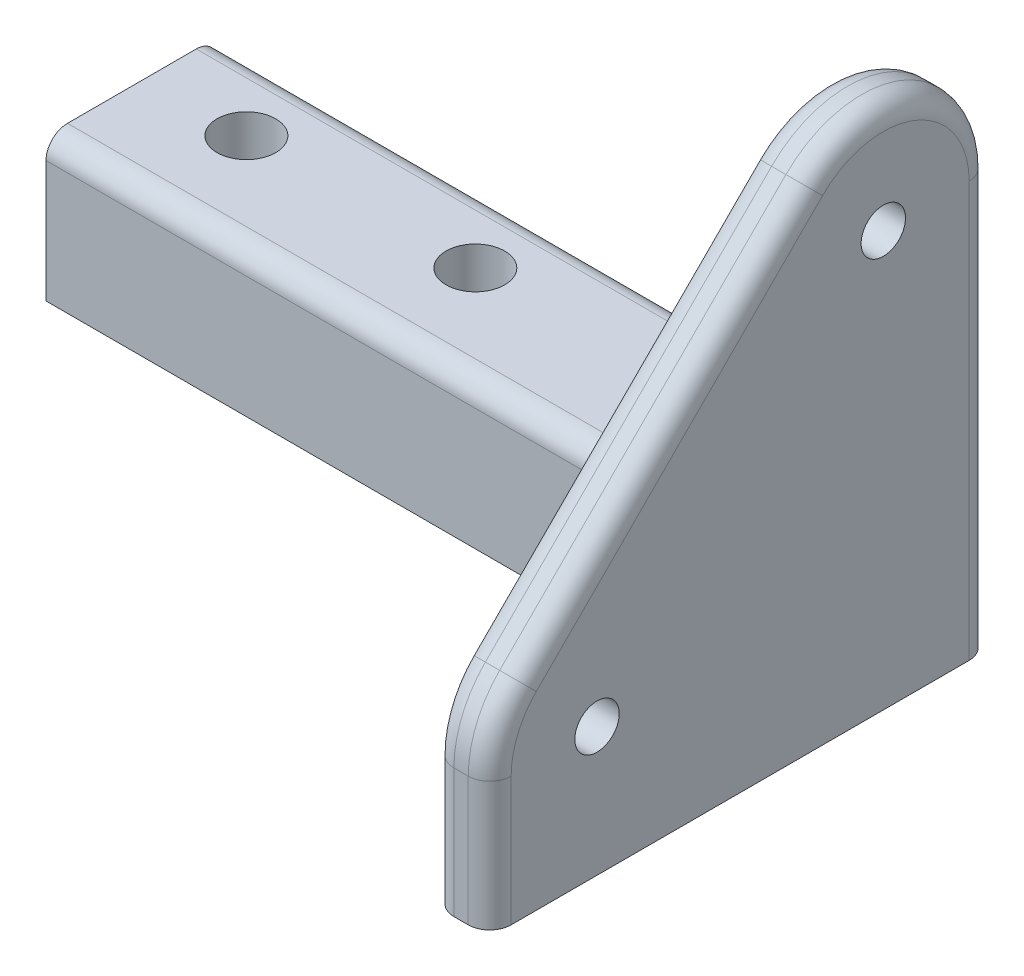
ISO-10303-21;
HEADER;
FILE_DESCRIPTION(('STEP AP214'),'2;1');
FILE_NAME('part.step','',(''),(''),'','','');
FILE_SCHEMA(('AUTOMOTIVE_DESIGN { 1 0 10303 214 1 1 1 1 }'));
ENDSEC;
DATA;
#1=APPLICATION_CONTEXT('core data for automotive mechanical design processes');
#2=APPLICATION_PROTOCOL_DEFINITION('international standard','automotive_design',2000,#1);
#3=PRODUCT_CONTEXT('',#1,'mechanical');
#4=PRODUCT('Part','Part','',(#3));
#5=PRODUCT_RELATED_PRODUCT_CATEGORY('part','',(#4));
#6=PRODUCT_DEFINITION_FORMATION('','',#4);
#7=PRODUCT_DEFINITION_CONTEXT('part definition',#1,'design');
#8=PRODUCT_DEFINITION('design','',#6,#7);
#9=PRODUCT_DEFINITION_SHAPE('','',#8);
#10=(LENGTH_UNIT() NAMED_UNIT(*) SI_UNIT(.MILLI.,.METRE.));
#11=(NAMED_UNIT(*) PLANE_ANGLE_UNIT() SI_UNIT($,.RADIAN.));
#12=(NAMED_UNIT(*) SI_UNIT($,.STERADIAN.) SOLID_ANGLE_UNIT());
#13=UNCERTAINTY_MEASURE_WITH_UNIT(LENGTH_MEASURE(1.E-05),#10,'distance_accuracy_value','');
#14=(GEOMETRIC_REPRESENTATION_CONTEXT(3) GLOBAL_UNCERTAINTY_ASSIGNED_CONTEXT((#13)) GLOBAL_UNIT_ASSIGNED_CONTEXT((#10,
#11,#12)) REPRESENTATION_CONTEXT('',''));
#15=CARTESIAN_POINT('',(0.,0.,0.));
#16=DIRECTION('',(0.,0.,1.));
#17=DIRECTION('',(1.,0.,0.));
#18=AXIS2_PLACEMENT_3D('',#15,#16,#17);
#19=CARTESIAN_POINT('',(115.,9.99999999999999,12.));
#20=DIRECTION('',(0.,-1.,0.));
#21=DIRECTION('',(1.,0.,0.));
#22=AXIS2_PLACEMENT_3D('',#19,#20,#21);
#23=PLANE('',#22);
#24=CARTESIAN_POINT('',(72.,10.,5.));
#25=DIRECTION('',(0.,-1.,0.));
#26=DIRECTION('',(0.,0.,-1.));
#27=AXIS2_PLACEMENT_3D('',#24,#25,#26);
#28=CIRCLE('',#27,2.04999999999999);
#29=CARTESIAN_POINT('',(72.,10.,2.95000000000001));
#30=VERTEX_POINT('',#29);
#31=EDGE_CURVE('E408',#30,#30,#28,.T.);
#32=ORIENTED_EDGE('',*,*,#31,.T.);
#33=EDGE_LOOP('',(#32));
#34=FACE_BOUND('',#33,.T.);
#35=DIRECTION('',(-1.,0.,0.));
#36=VECTOR('',#35,1.);
#37=CARTESIAN_POINT('',(115.,9.99999999999999,10.5));
#38=LINE('',#37,#36);
#39=CARTESIAN_POINT('',(65.,9.99999999999999,10.5));
#40=VERTEX_POINT('',#39);
#41=CARTESIAN_POINT('',(110.,9.99999999999999,10.5));
#42=VERTEX_POINT('',#41);
#43=EDGE_CURVE('E411',#40,#42,#38,.F.);
#44=ORIENTED_EDGE('',*,*,#43,.T.);
#45=DIRECTION('',(0.,0.,-1.));
#46=VECTOR('',#45,1.);
#47=CARTESIAN_POINT('',(110.,9.99999999999999,1.5));
#48=LINE('',#47,#46);
#49=CARTESIAN_POINT('',(110.,9.99999999999999,1.5));
#50=VERTEX_POINT('',#49);
#51=EDGE_CURVE('E89',#42,#50,#48,.T.);
#52=ORIENTED_EDGE('',*,*,#51,.T.);
#53=DIRECTION('',(-1.,0.,0.));
#54=VECTOR('',#53,1.);
#55=CARTESIAN_POINT('',(115.,9.99999999999999,1.5));
#56=LINE('',#55,#54);
#57=CARTESIAN_POINT('',(65.,9.99999999999999,1.5));
#58=VERTEX_POINT('',#57);
#59=EDGE_CURVE('E519',#50,#58,#56,.T.);
#60=ORIENTED_EDGE('',*,*,#59,.T.);
#61=DIRECTION('',(0.,0.,-1.));
#62=VECTOR('',#61,1.);
#63=CARTESIAN_POINT('',(65.,9.99999999999999,12.));
#64=LINE('',#63,#62);
#65=EDGE_CURVE('E231',#40,#58,#64,.T.);
#66=ORIENTED_EDGE('',*,*,#65,.F.);
#67=EDGE_LOOP('',(#44,#52,#60,#66));
#68=FACE_BOUND('',#67,.T.);
#69=CARTESIAN_POINT('',(88.,10.,5.));
#70=DIRECTION('',(0.,1.,0.));
#71=DIRECTION('',(0.,0.,1.));
#72=AXIS2_PLACEMENT_3D('',#69,#70,#71);
#73=CIRCLE('',#72,2.04999999999999);
#74=CARTESIAN_POINT('',(88.,10.,7.05));
#75=VERTEX_POINT('',#74);
#76=EDGE_CURVE('E321',#75,#75,#73,.T.);
#77=ORIENTED_EDGE('',*,*,#76,.F.);
#78=EDGE_LOOP('',(#77));
#79=FACE_BOUND('',#78,.T.);
#80=ADVANCED_FACE('F75',(#34,#68,#79),#23,.F.);
#81=CARTESIAN_POINT('',(65.,0.,12.));
#82=DIRECTION('',(0.,1.,0.));
#83=DIRECTION('',(0.,0.,1.));
#84=AXIS2_PLACEMENT_3D('',#81,#82,#83);
#85=PLANE('',#84);
#86=CARTESIAN_POINT('',(72.,0.,5.));
#87=DIRECTION('',(0.,-1.,0.));
#88=DIRECTION('',(0.,0.,-1.));
#89=AXIS2_PLACEMENT_3D('',#86,#87,#88);
#90=CIRCLE('',#89,2.04999999999999);
#91=CARTESIAN_POINT('',(72.,0.,2.95000000000001));
#92=VERTEX_POINT('',#91);
#93=EDGE_CURVE('E418',#92,#92,#90,.T.);
#94=ORIENTED_EDGE('',*,*,#93,.F.);
#95=EDGE_LOOP('',(#94));
#96=FACE_BOUND('',#95,.T.);
#97=DIRECTION('',(1.,0.,0.));
#98=VECTOR('',#97,1.);
#99=CARTESIAN_POINT('',(65.,0.,0.));
#100=LINE('',#99,#98);
#101=CARTESIAN_POINT('',(65.,0.,0.));
#102=VERTEX_POINT('',#101);
#103=CARTESIAN_POINT('',(117.5,0.,0.));
#104=VERTEX_POINT('',#103);
#105=EDGE_CURVE('E220',#102,#104,#100,.T.);
#106=ORIENTED_EDGE('',*,*,#105,.T.);
#107=CARTESIAN_POINT('',(117.5,0.,1.5));
#108=DIRECTION('',(0.,1.,0.));
#109=DIRECTION('',(0.,0.,1.));
#110=AXIS2_PLACEMENT_3D('',#107,#108,#109);
#111=CIRCLE('',#110,1.5);
#112=CARTESIAN_POINT('',(119.,0.,1.5));
#113=VERTEX_POINT('',#112);
#114=EDGE_CURVE('E511',#104,#113,#111,.F.);
#115=ORIENTED_EDGE('',*,*,#114,.T.);
#116=DIRECTION('',(0.,0.,-1.));
#117=VECTOR('',#116,1.);
#118=CARTESIAN_POINT('',(119.,0.,0.));
#119=LINE('',#118,#117);
#120=CARTESIAN_POINT('',(119.,0.,33.5));
#121=VERTEX_POINT('',#120);
#122=EDGE_CURVE('E431',#121,#113,#119,.T.);
#123=ORIENTED_EDGE('',*,*,#122,.F.);
#124=CARTESIAN_POINT('',(117.5,0.,33.5));
#125=DIRECTION('',(0.,1.,0.));
#126=DIRECTION('',(0.,0.,1.));
#127=AXIS2_PLACEMENT_3D('',#124,#125,#126);
#128=CIRCLE('',#127,1.5);
#129=CARTESIAN_POINT('',(117.5,0.,35.));
#130=VERTEX_POINT('',#129);
#131=EDGE_CURVE('E570',#121,#130,#128,.F.);
#132=ORIENTED_EDGE('',*,*,#131,.T.);
#133=DIRECTION('',(-1.,0.,0.));
#134=VECTOR('',#133,1.);
#135=CARTESIAN_POINT('',(119.,0.,35.));
#136=LINE('',#135,#134);
#137=CARTESIAN_POINT('',(116.5,0.,35.));
#138=VERTEX_POINT('',#137);
#139=EDGE_CURVE('E434',#130,#138,#136,.T.);
#140=ORIENTED_EDGE('',*,*,#139,.T.);
#141=CARTESIAN_POINT('',(116.5,0.,33.5));
#142=DIRECTION('',(0.,1.,0.));
#143=DIRECTION('',(0.,0.,1.));
#144=AXIS2_PLACEMENT_3D('',#141,#142,#143);
#145=CIRCLE('',#144,1.5);
#146=CARTESIAN_POINT('',(115.,0.,33.5));
#147=VERTEX_POINT('',#146);
#148=EDGE_CURVE('E572',#138,#147,#145,.F.);
#149=ORIENTED_EDGE('',*,*,#148,.T.);
#150=DIRECTION('',(0.,0.,-1.));
#151=VECTOR('',#150,1.);
#152=CARTESIAN_POINT('',(115.,0.,0.));
#153=LINE('',#152,#151);
#154=CARTESIAN_POINT('',(115.,0.,17.));
#155=VERTEX_POINT('',#154);
#156=EDGE_CURVE('E428',#147,#155,#153,.T.);
#157=ORIENTED_EDGE('',*,*,#156,.T.);
#158=DIRECTION('',(-0.70710678118655,0.,-0.707106781186545));
#159=VECTOR('',#158,1.);
#160=CARTESIAN_POINT('',(87.4999999999998,0.,-10.5));
#161=LINE('',#160,#159);
#162=CARTESIAN_POINT('',(110.,0.,12.));
#163=VERTEX_POINT('',#162);
#164=EDGE_CURVE('E12',#155,#163,#161,.T.);
#165=ORIENTED_EDGE('',*,*,#164,.T.);
#166=DIRECTION('',(1.,0.,0.));
#167=VECTOR('',#166,1.);
#168=CARTESIAN_POINT('',(65.,0.,12.));
#169=LINE('',#168,#167);
#170=CARTESIAN_POINT('',(65.,0.,12.));
#171=VERTEX_POINT('',#170);
#172=EDGE_CURVE('E215',#171,#163,#169,.T.);
#173=ORIENTED_EDGE('',*,*,#172,.F.);
#174=DIRECTION('',(0.,0.,-1.));
#175=VECTOR('',#174,1.);
#176=CARTESIAN_POINT('',(65.,0.,12.));
#177=LINE('',#176,#175);
#178=EDGE_CURVE('E223',#171,#102,#177,.T.);
#179=ORIENTED_EDGE('',*,*,#178,.T.);
#180=EDGE_LOOP('',(#106,#115,#123,#132,#140,#149,#157,#165,#173,#179));
#181=FACE_BOUND('',#180,.T.);
#182=CARTESIAN_POINT('',(88.,0.,5.));
#183=DIRECTION('',(0.,1.,0.));
#184=DIRECTION('',(0.,0.,1.));
#185=AXIS2_PLACEMENT_3D('',#182,#183,#184);
#186=CIRCLE('',#185,2.04999999999999);
#187=CARTESIAN_POINT('',(88.,0.,7.05));
#188=VERTEX_POINT('',#187);
#189=EDGE_CURVE('E415',#188,#188,#186,.T.);
#190=ORIENTED_EDGE('',*,*,#189,.T.);
#191=EDGE_LOOP('',(#190));
#192=FACE_BOUND('',#191,.T.);
#193=ADVANCED_FACE('F233',(#96,#181,#192),#85,.F.);
#194=CARTESIAN_POINT('',(65.,9.99999999999999,12.));
#195=DIRECTION('',(1.,0.,0.));
#196=DIRECTION('',(0.,0.,-1.));
#197=AXIS2_PLACEMENT_3D('',#194,#195,#196);
#198=PLANE('',#197);
#199=ORIENTED_EDGE('',*,*,#65,.T.);
#200=CARTESIAN_POINT('',(65.,8.49999999999999,1.5));
#201=DIRECTION('',(1.,0.,0.));
#202=DIRECTION('',(0.,0.,-1.));
#203=AXIS2_PLACEMENT_3D('',#200,#201,#202);
#204=CIRCLE('',#203,1.5);
#205=CARTESIAN_POINT('',(65.,8.49999999999999,0.));
#206=VERTEX_POINT('',#205);
#207=EDGE_CURVE('E532',#58,#206,#204,.F.);
#208=ORIENTED_EDGE('',*,*,#207,.T.);
#209=DIRECTION('',(0.,-1.,0.));
#210=VECTOR('',#209,1.);
#211=CARTESIAN_POINT('',(65.,9.99999999999999,0.));
#212=LINE('',#211,#210);
#213=EDGE_CURVE('E227',#206,#102,#212,.T.);
#214=ORIENTED_EDGE('',*,*,#213,.T.);
#215=ORIENTED_EDGE('',*,*,#178,.F.);
#216=DIRECTION('',(0.,-1.,0.));
#217=VECTOR('',#216,1.);
#218=CARTESIAN_POINT('',(65.,9.99999999999999,12.));
#219=LINE('',#218,#217);
#220=CARTESIAN_POINT('',(65.,8.49999999999999,12.));
#221=VERTEX_POINT('',#220);
#222=EDGE_CURVE('E210',#221,#171,#219,.T.);
#223=ORIENTED_EDGE('',*,*,#222,.F.);
#224=CARTESIAN_POINT('',(65.,8.49999999999999,10.5));
#225=DIRECTION('',(1.,0.,0.));
#226=DIRECTION('',(0.,0.,-1.));
#227=AXIS2_PLACEMENT_3D('',#224,#225,#226);
#228=CIRCLE('',#227,1.5);
#229=EDGE_CURVE('E522',#221,#40,#228,.F.);
#230=ORIENTED_EDGE('',*,*,#229,.T.);
#231=EDGE_LOOP('',(#199,#208,#214,#215,#223,#230));
#232=FACE_BOUND('',#231,.T.);
#233=ADVANCED_FACE('F225',(#232),#198,.F.);
#234=CARTESIAN_POINT('',(0.,0.,12.));
#235=DIRECTION('',(0.,0.,1.));
#236=DIRECTION('',(1.,0.,0.));
#237=AXIS2_PLACEMENT_3D('',#234,#235,#236);
#238=PLANE('',#237);
#239=ORIENTED_EDGE('',*,*,#172,.T.);
#240=DIRECTION('',(0.,1.,0.));
#241=VECTOR('',#240,1.);
#242=CARTESIAN_POINT('',(110.,0.,12.));
#243=LINE('',#242,#241);
#244=CARTESIAN_POINT('',(110.,8.49999999999999,12.));
#245=VERTEX_POINT('',#244);
#246=EDGE_CURVE('E262',#163,#245,#243,.T.);
#247=ORIENTED_EDGE('',*,*,#246,.T.);
#248=DIRECTION('',(-1.,0.,0.));
#249=VECTOR('',#248,1.);
#250=CARTESIAN_POINT('',(65.,8.49999999999999,12.));
#251=LINE('',#250,#249);
#252=EDGE_CURVE('E217',#245,#221,#251,.T.);
#253=ORIENTED_EDGE('',*,*,#252,.T.);
#254=ORIENTED_EDGE('',*,*,#222,.T.);
#255=EDGE_LOOP('',(#239,#247,#253,#254));
#256=FACE_BOUND('',#255,.T.);
#257=ADVANCED_FACE('F212',(#256),#238,.T.);
#258=CARTESIAN_POINT('',(0.,0.,0.));
#259=DIRECTION('',(0.,0.,1.));
#260=DIRECTION('',(1.,0.,0.));
#261=AXIS2_PLACEMENT_3D('',#258,#259,#260);
#262=PLANE('',#261);
#263=DIRECTION('',(-1.,0.,0.));
#264=VECTOR('',#263,1.);
#265=CARTESIAN_POINT('',(119.,29.,0.));
#266=LINE('',#265,#264);
#267=CARTESIAN_POINT('',(117.5,29.,0.));
#268=VERTEX_POINT('',#267);
#269=CARTESIAN_POINT('',(116.5,29.,0.));
#270=VERTEX_POINT('',#269);
#271=EDGE_CURVE('E241',#268,#270,#266,.T.);
#272=ORIENTED_EDGE('',*,*,#271,.F.);
#273=DIRECTION('',(0.,-1.,0.));
#274=VECTOR('',#273,1.);
#275=CARTESIAN_POINT('',(117.5,0.,0.));
#276=LINE('',#275,#274);
#277=EDGE_CURVE('E255',#268,#104,#276,.T.);
#278=ORIENTED_EDGE('',*,*,#277,.T.);
#279=ORIENTED_EDGE('',*,*,#105,.F.);
#280=ORIENTED_EDGE('',*,*,#213,.F.);
#281=DIRECTION('',(-1.,0.,0.));
#282=VECTOR('',#281,1.);
#283=CARTESIAN_POINT('',(0.,8.49999999999999,0.));
#284=LINE('',#283,#282);
#285=CARTESIAN_POINT('',(116.5,8.49999999999999,0.));
#286=VERTEX_POINT('',#285);
#287=EDGE_CURVE('E261',#206,#286,#284,.F.);
#288=ORIENTED_EDGE('',*,*,#287,.T.);
#289=DIRECTION('',(0.,-1.,0.));
#290=VECTOR('',#289,1.);
#291=CARTESIAN_POINT('',(116.5,0.,0.));
#292=LINE('',#291,#290);
#293=EDGE_CURVE('E474',#286,#270,#292,.F.);
#294=ORIENTED_EDGE('',*,*,#293,.T.);
#295=EDGE_LOOP('',(#272,#278,#279,#280,#288,#294));
#296=FACE_BOUND('',#295,.T.);
#297=ADVANCED_FACE('F530',(#296),#262,.F.);
#298=CARTESIAN_POINT('',(119.,29.,7.5));
#299=DIRECTION('',(-1.,0.,0.));
#300=DIRECTION('',(0.,0.,1.));
#301=AXIS2_PLACEMENT_3D('',#298,#299,#300);
#302=CYLINDRICAL_SURFACE('',#301,7.50000000000001);
#303=ORIENTED_EDGE('',*,*,#271,.T.);
#304=CARTESIAN_POINT('',(116.5,29.,7.5));
#305=DIRECTION('',(1.,0.,0.));
#306=DIRECTION('',(0.,0.,-1.));
#307=AXIS2_PLACEMENT_3D('',#304,#305,#306);
#308=CIRCLE('',#307,7.50000000000001);
#309=CARTESIAN_POINT('',(116.5,34.3033008588991,12.8033008588991));
#310=VERTEX_POINT('',#309);
#311=EDGE_CURVE('E459',#270,#310,#308,.T.);
#312=ORIENTED_EDGE('',*,*,#311,.T.);
#313=DIRECTION('',(-1.,0.,0.));
#314=VECTOR('',#313,1.);
#315=CARTESIAN_POINT('',(119.,34.3033008588991,12.8033008588991));
#316=LINE('',#315,#314);
#317=CARTESIAN_POINT('',(117.5,34.3033008588991,12.8033008588991));
#318=VERTEX_POINT('',#317);
#319=EDGE_CURVE('E451',#318,#310,#316,.T.);
#320=ORIENTED_EDGE('',*,*,#319,.F.);
#321=CARTESIAN_POINT('',(117.5,29.,7.5));
#322=DIRECTION('',(1.,0.,0.));
#323=DIRECTION('',(0.,0.,-1.));
#324=AXIS2_PLACEMENT_3D('',#321,#322,#323);
#325=CIRCLE('',#324,7.50000000000001);
#326=EDGE_CURVE('E461',#318,#268,#325,.F.);
#327=ORIENTED_EDGE('',*,*,#326,.T.);
#328=EDGE_LOOP('',(#303,#312,#320,#327));
#329=FACE_BOUND('',#328,.T.);
#330=ADVANCED_FACE('F457',(#329),#302,.T.);
#331=CARTESIAN_POINT('',(119.,23.5533008588991,23.5533008588991));
#332=DIRECTION('',(0.,-0.707106781186547,-0.707106781186547));
#333=DIRECTION('',(0.,0.707106781186548,-0.707106781186548));
#334=AXIS2_PLACEMENT_3D('',#331,#332,#333);
#335=PLANE('',#334);
#336=ORIENTED_EDGE('',*,*,#319,.T.);
#337=DIRECTION('',(0.,-0.707106781186548,0.707106781186548));
#338=VECTOR('',#337,1.);
#339=CARTESIAN_POINT('',(116.5,23.5533008588991,23.5533008588991));
#340=LINE('',#339,#338);
#341=CARTESIAN_POINT('',(116.5,14.3033008588992,32.8033008588991));
#342=VERTEX_POINT('',#341);
#343=EDGE_CURVE('E561',#310,#342,#340,.T.);
#344=ORIENTED_EDGE('',*,*,#343,.T.);
#345=DIRECTION('',(-1.,0.,0.));
#346=VECTOR('',#345,1.);
#347=CARTESIAN_POINT('',(119.,14.3033008588992,32.8033008588991));
#348=LINE('',#347,#346);
#349=CARTESIAN_POINT('',(117.5,14.3033008588992,32.8033008588991));
#350=VERTEX_POINT('',#349);
#351=EDGE_CURVE('E448',#350,#342,#348,.T.);
#352=ORIENTED_EDGE('',*,*,#351,.F.);
#353=DIRECTION('',(0.,-0.707106781186548,0.707106781186548));
#354=VECTOR('',#353,1.);
#355=CARTESIAN_POINT('',(117.5,34.3033008588991,12.8033008588991));
#356=LINE('',#355,#354);
#357=EDGE_CURVE('E472',#350,#318,#356,.F.);
#358=ORIENTED_EDGE('',*,*,#357,.T.);
#359=EDGE_LOOP('',(#336,#344,#352,#358));
#360=FACE_BOUND('',#359,.T.);
#361=ADVANCED_FACE('F595',(#360),#335,.F.);
#362=CARTESIAN_POINT('',(119.,9.00000000000005,27.5));
#363=DIRECTION('',(-1.,0.,0.));
#364=DIRECTION('',(0.,0.,1.));
#365=AXIS2_PLACEMENT_3D('',#362,#363,#364);
#366=CYLINDRICAL_SURFACE('',#365,7.5);
#367=ORIENTED_EDGE('',*,*,#351,.T.);
#368=CARTESIAN_POINT('',(116.5,9.00000000000005,27.5));
#369=DIRECTION('',(1.,0.,0.));
#370=DIRECTION('',(0.,0.,-1.));
#371=AXIS2_PLACEMENT_3D('',#368,#369,#370);
#372=CIRCLE('',#371,7.5);
#373=CARTESIAN_POINT('',(116.5,9.00000000000005,35.));
#374=VERTEX_POINT('',#373);
#375=EDGE_CURVE('E565',#342,#374,#372,.T.);
#376=ORIENTED_EDGE('',*,*,#375,.T.);
#377=DIRECTION('',(-1.,0.,0.));
#378=VECTOR('',#377,1.);
#379=CARTESIAN_POINT('',(119.,9.00000000000005,35.));
#380=LINE('',#379,#378);
#381=CARTESIAN_POINT('',(117.5,9.00000000000005,35.));
#382=VERTEX_POINT('',#381);
#383=EDGE_CURVE('E445',#382,#374,#380,.T.);
#384=ORIENTED_EDGE('',*,*,#383,.F.);
#385=CARTESIAN_POINT('',(117.5,9.00000000000005,27.5));
#386=DIRECTION('',(1.,0.,0.));
#387=DIRECTION('',(0.,0.,-1.));
#388=AXIS2_PLACEMENT_3D('',#385,#386,#387);
#389=CIRCLE('',#388,7.5);
#390=EDGE_CURVE('E502',#382,#350,#389,.F.);
#391=ORIENTED_EDGE('',*,*,#390,.T.);
#392=EDGE_LOOP('',(#367,#376,#384,#391));
#393=FACE_BOUND('',#392,.T.);
#394=ADVANCED_FACE('F594',(#393),#366,.T.);
#395=CARTESIAN_POINT('',(119.,0.,35.));
#396=DIRECTION('',(0.,0.,-1.));
#397=DIRECTION('',(0.,1.,0.));
#398=AXIS2_PLACEMENT_3D('',#395,#396,#397);
#399=PLANE('',#398);
#400=ORIENTED_EDGE('',*,*,#383,.T.);
#401=DIRECTION('',(0.,-1.,0.));
#402=VECTOR('',#401,1.);
#403=CARTESIAN_POINT('',(116.5,0.,35.));
#404=LINE('',#403,#402);
#405=EDGE_CURVE('E482',#374,#138,#404,.T.);
#406=ORIENTED_EDGE('',*,*,#405,.T.);
#407=ORIENTED_EDGE('',*,*,#139,.F.);
#408=DIRECTION('',(0.,-1.,0.));
#409=VECTOR('',#408,1.);
#410=CARTESIAN_POINT('',(117.5,9.00000000000005,35.));
#411=LINE('',#410,#409);
#412=EDGE_CURVE('E580',#130,#382,#411,.F.);
#413=ORIENTED_EDGE('',*,*,#412,.T.);
#414=EDGE_LOOP('',(#400,#406,#407,#413));
#415=FACE_BOUND('',#414,.T.);
#416=ADVANCED_FACE('F584',(#415),#399,.F.);
#417=CARTESIAN_POINT('',(119.,9.00000000000005,27.5));
#418=DIRECTION('',(-1.,0.,0.));
#419=DIRECTION('',(0.,0.,1.));
#420=AXIS2_PLACEMENT_3D('',#417,#418,#419);
#421=CYLINDRICAL_SURFACE('',#420,1.55);
#422=CARTESIAN_POINT('',(119.,9.00000000000005,27.5));
#423=DIRECTION('',(1.,0.,0.));
#424=DIRECTION('',(0.,0.,-1.));
#425=AXIS2_PLACEMENT_3D('',#422,#423,#424);
#426=CIRCLE('',#425,1.55);
#427=CARTESIAN_POINT('',(119.,9.00000000000005,25.95));
#428=VERTEX_POINT('',#427);
#429=EDGE_CURVE('E427',#428,#428,#426,.T.);
#430=ORIENTED_EDGE('',*,*,#429,.T.);
#431=EDGE_LOOP('',(#430));
#432=FACE_BOUND('',#431,.T.);
#433=CARTESIAN_POINT('',(115.,9.00000000000005,27.5));
#434=DIRECTION('',(1.,0.,0.));
#435=DIRECTION('',(0.,0.,-1.));
#436=AXIS2_PLACEMENT_3D('',#433,#434,#435);
#437=CIRCLE('',#436,1.55);
#438=CARTESIAN_POINT('',(115.,9.00000000000005,25.95));
#439=VERTEX_POINT('',#438);
#440=EDGE_CURVE('E438',#439,#439,#437,.T.);
#441=ORIENTED_EDGE('',*,*,#440,.F.);
#442=EDGE_LOOP('',(#441));
#443=FACE_BOUND('',#442,.T.);
#444=ADVANCED_FACE('F606',(#432,#443),#421,.F.);
#445=CARTESIAN_POINT('',(119.,29.,7.5));
#446=DIRECTION('',(-1.,0.,0.));
#447=DIRECTION('',(0.,0.,1.));
#448=AXIS2_PLACEMENT_3D('',#445,#446,#447);
#449=CYLINDRICAL_SURFACE('',#448,1.55);
#450=CARTESIAN_POINT('',(119.,29.,7.5));
#451=DIRECTION('',(1.,0.,0.));
#452=DIRECTION('',(0.,0.,-1.));
#453=AXIS2_PLACEMENT_3D('',#450,#451,#452);
#454=CIRCLE('',#453,1.55);
#455=CARTESIAN_POINT('',(119.,29.,5.95));
#456=VERTEX_POINT('',#455);
#457=EDGE_CURVE('E424',#456,#456,#454,.F.);
#458=ORIENTED_EDGE('',*,*,#457,.F.);
#459=EDGE_LOOP('',(#458));
#460=FACE_BOUND('',#459,.T.);
#461=CARTESIAN_POINT('',(115.,29.,7.5));
#462=DIRECTION('',(1.,0.,0.));
#463=DIRECTION('',(0.,0.,-1.));
#464=AXIS2_PLACEMENT_3D('',#461,#462,#463);
#465=CIRCLE('',#464,1.55);
#466=CARTESIAN_POINT('',(115.,29.,5.95));
#467=VERTEX_POINT('',#466);
#468=EDGE_CURVE('E435',#467,#467,#465,.F.);
#469=ORIENTED_EDGE('',*,*,#468,.T.);
#470=EDGE_LOOP('',(#469));
#471=FACE_BOUND('',#470,.T.);
#472=ADVANCED_FACE('F609',(#460,#471),#449,.F.);
#473=CARTESIAN_POINT('',(115.,0.,0.));
#474=DIRECTION('',(1.,0.,0.));
#475=DIRECTION('',(0.,0.,-1.));
#476=AXIS2_PLACEMENT_3D('',#473,#474,#475);
#477=PLANE('',#476);
#478=CARTESIAN_POINT('',(115.,8.49999999999999,10.5));
#479=DIRECTION('',(1.,0.,0.));
#480=DIRECTION('',(0.,0.,-1.));
#481=AXIS2_PLACEMENT_3D('',#478,#479,#480);
#482=CIRCLE('',#481,6.49999999999998);
#483=CARTESIAN_POINT('',(115.,15.,10.5));
#484=VERTEX_POINT('',#483);
#485=CARTESIAN_POINT('',(115.,8.49999999999999,17.));
#486=VERTEX_POINT('',#485);
#487=EDGE_CURVE('E266',#484,#486,#482,.T.);
#488=ORIENTED_EDGE('',*,*,#487,.T.);
#489=DIRECTION('',(0.,-1.,0.));
#490=VECTOR('',#489,1.);
#491=CARTESIAN_POINT('',(115.,0.,17.));
#492=LINE('',#491,#490);
#493=EDGE_CURVE('E270',#486,#155,#492,.T.);
#494=ORIENTED_EDGE('',*,*,#493,.T.);
#495=ORIENTED_EDGE('',*,*,#156,.F.);
#496=DIRECTION('',(0.,-1.,0.));
#497=VECTOR('',#496,1.);
#498=CARTESIAN_POINT('',(115.,0.,33.5));
#499=LINE('',#498,#497);
#500=CARTESIAN_POINT('',(115.,9.00000000000005,33.5));
#501=VERTEX_POINT('',#500);
#502=EDGE_CURVE('E244',#147,#501,#499,.F.);
#503=ORIENTED_EDGE('',*,*,#502,.T.);
#504=CARTESIAN_POINT('',(115.,9.00000000000005,27.5));
#505=DIRECTION('',(1.,0.,0.));
#506=DIRECTION('',(0.,0.,-1.));
#507=AXIS2_PLACEMENT_3D('',#504,#505,#506);
#508=CIRCLE('',#507,6.);
#509=CARTESIAN_POINT('',(115.,13.2426406871193,31.7426406871193));
#510=VERTEX_POINT('',#509);
#511=EDGE_CURVE('E246',#501,#510,#508,.F.);
#512=ORIENTED_EDGE('',*,*,#511,.T.);
#513=DIRECTION('',(0.,-0.707106781186548,0.707106781186548));
#514=VECTOR('',#513,1.);
#515=CARTESIAN_POINT('',(115.,22.4926406871193,22.4926406871193));
#516=LINE('',#515,#514);
#517=CARTESIAN_POINT('',(115.,33.2426406871193,11.7426406871193));
#518=VERTEX_POINT('',#517);
#519=EDGE_CURVE('E248',#510,#518,#516,.F.);
#520=ORIENTED_EDGE('',*,*,#519,.T.);
#521=CARTESIAN_POINT('',(115.,29.,7.5));
#522=DIRECTION('',(1.,0.,0.));
#523=DIRECTION('',(0.,0.,-1.));
#524=AXIS2_PLACEMENT_3D('',#521,#522,#523);
#525=CIRCLE('',#524,6.00000000000001);
#526=CARTESIAN_POINT('',(115.,29.,1.49999999999999));
#527=VERTEX_POINT('',#526);
#528=EDGE_CURVE('E250',#518,#527,#525,.F.);
#529=ORIENTED_EDGE('',*,*,#528,.T.);
#530=DIRECTION('',(0.,-1.,0.));
#531=VECTOR('',#530,1.);
#532=CARTESIAN_POINT('',(115.,0.,1.5));
#533=LINE('',#532,#531);
#534=CARTESIAN_POINT('',(115.,15.,1.5));
#535=VERTEX_POINT('',#534);
#536=EDGE_CURVE('E252',#527,#535,#533,.T.);
#537=ORIENTED_EDGE('',*,*,#536,.T.);
#538=DIRECTION('',(0.,0.,1.));
#539=VECTOR('',#538,1.);
#540=CARTESIAN_POINT('',(115.,15.,10.5));
#541=LINE('',#540,#539);
#542=EDGE_CURVE('E264',#535,#484,#541,.T.);
#543=ORIENTED_EDGE('',*,*,#542,.T.);
#544=EDGE_LOOP('',(#488,#494,#495,#503,#512,#520,#529,#537,#543));
#545=FACE_BOUND('',#544,.T.);
#546=ORIENTED_EDGE('',*,*,#468,.F.);
#547=EDGE_LOOP('',(#546));
#548=FACE_BOUND('',#547,.T.);
#549=ORIENTED_EDGE('',*,*,#440,.T.);
#550=EDGE_LOOP('',(#549));
#551=FACE_BOUND('',#550,.T.);
#552=ADVANCED_FACE('F554',(#545,#548,#551),#477,.F.);
#553=CARTESIAN_POINT('',(119.,0.,0.));
#554=DIRECTION('',(1.,0.,0.));
#555=DIRECTION('',(0.,0.,-1.));
#556=AXIS2_PLACEMENT_3D('',#553,#554,#555);
#557=PLANE('',#556);
#558=ORIENTED_EDGE('',*,*,#122,.T.);
#559=DIRECTION('',(0.,-1.,0.));
#560=VECTOR('',#559,1.);
#561=CARTESIAN_POINT('',(119.,29.,1.5));
#562=LINE('',#561,#560);
#563=CARTESIAN_POINT('',(119.,29.,1.49999999999999));
#564=VERTEX_POINT('',#563);
#565=EDGE_CURVE('E516',#113,#564,#562,.F.);
#566=ORIENTED_EDGE('',*,*,#565,.T.);
#567=CARTESIAN_POINT('',(119.,29.,7.5));
#568=DIRECTION('',(1.,0.,0.));
#569=DIRECTION('',(0.,0.,-1.));
#570=AXIS2_PLACEMENT_3D('',#567,#568,#569);
#571=CIRCLE('',#570,6.00000000000001);
#572=CARTESIAN_POINT('',(119.,33.2426406871193,11.7426406871193));
#573=VERTEX_POINT('',#572);
#574=EDGE_CURVE('E509',#564,#573,#571,.T.);
#575=ORIENTED_EDGE('',*,*,#574,.T.);
#576=DIRECTION('',(0.,-0.707106781186548,0.707106781186548));
#577=VECTOR('',#576,1.);
#578=CARTESIAN_POINT('',(119.,13.2426406871193,31.7426406871193));
#579=LINE('',#578,#577);
#580=CARTESIAN_POINT('',(119.,13.2426406871193,31.7426406871193));
#581=VERTEX_POINT('',#580);
#582=EDGE_CURVE('E499',#573,#581,#579,.T.);
#583=ORIENTED_EDGE('',*,*,#582,.T.);
#584=CARTESIAN_POINT('',(119.,9.00000000000005,27.5));
#585=DIRECTION('',(1.,0.,0.));
#586=DIRECTION('',(0.,0.,-1.));
#587=AXIS2_PLACEMENT_3D('',#584,#585,#586);
#588=CIRCLE('',#587,6.);
#589=CARTESIAN_POINT('',(119.,9.00000000000005,33.5));
#590=VERTEX_POINT('',#589);
#591=EDGE_CURVE('E503',#581,#590,#588,.T.);
#592=ORIENTED_EDGE('',*,*,#591,.T.);
#593=DIRECTION('',(0.,-1.,0.));
#594=VECTOR('',#593,1.);
#595=CARTESIAN_POINT('',(119.,0.,33.5));
#596=LINE('',#595,#594);
#597=EDGE_CURVE('E507',#590,#121,#596,.T.);
#598=ORIENTED_EDGE('',*,*,#597,.T.);
#599=EDGE_LOOP('',(#558,#566,#575,#583,#592,#598));
#600=FACE_BOUND('',#599,.T.);
#601=ORIENTED_EDGE('',*,*,#457,.T.);
#602=EDGE_LOOP('',(#601));
#603=FACE_BOUND('',#602,.T.);
#604=ORIENTED_EDGE('',*,*,#429,.F.);
#605=EDGE_LOOP('',(#604));
#606=FACE_BOUND('',#605,.T.);
#607=ADVANCED_FACE('F387',(#600,#603,#606),#557,.T.);
#608=CARTESIAN_POINT('',(116.5,0.,33.5));
#609=DIRECTION('',(0.,-1.,0.));
#610=DIRECTION('',(0.,0.,-1.));
#611=AXIS2_PLACEMENT_3D('',#608,#609,#610);
#612=CYLINDRICAL_SURFACE('',#611,1.5);
#613=ORIENTED_EDGE('',*,*,#148,.F.);
#614=ORIENTED_EDGE('',*,*,#405,.F.);
#615=CARTESIAN_POINT('',(116.5,9.00000000000005,33.5));
#616=DIRECTION('',(0.,1.,0.));
#617=DIRECTION('',(0.,0.,1.));
#618=AXIS2_PLACEMENT_3D('',#615,#616,#617);
#619=CIRCLE('',#618,1.5);
#620=EDGE_CURVE('E439',#501,#374,#619,.T.);
#621=ORIENTED_EDGE('',*,*,#620,.F.);
#622=ORIENTED_EDGE('',*,*,#502,.F.);
#623=EDGE_LOOP('',(#613,#614,#621,#622));
#624=FACE_BOUND('',#623,.T.);
#625=ADVANCED_FACE('F383',(#624),#612,.T.);
#626=CARTESIAN_POINT('',(116.5,9.00000000000005,27.5));
#627=DIRECTION('',(1.,0.,0.));
#628=DIRECTION('',(0.,0.,-1.));
#629=AXIS2_PLACEMENT_3D('',#626,#627,#628);
#630=TOROIDAL_SURFACE('',#629,6.,1.5);
#631=ORIENTED_EDGE('',*,*,#620,.T.);
#632=ORIENTED_EDGE('',*,*,#375,.F.);
#633=CARTESIAN_POINT('',(116.5,13.2426406871193,31.7426406871193));
#634=DIRECTION('',(0.,0.707106781186549,-0.707106781186546));
#635=DIRECTION('',(0.,0.707106781186546,0.707106781186549));
#636=AXIS2_PLACEMENT_3D('',#633,#634,#635);
#637=CIRCLE('',#636,1.5);
#638=EDGE_CURVE('E477',#510,#342,#637,.T.);
#639=ORIENTED_EDGE('',*,*,#638,.F.);
#640=ORIENTED_EDGE('',*,*,#511,.F.);
#641=EDGE_LOOP('',(#631,#632,#639,#640));
#642=FACE_BOUND('',#641,.T.);
#643=ADVANCED_FACE('F386',(#642),#630,.T.);
#644=CARTESIAN_POINT('',(116.5,22.4926406871193,22.4926406871193));
#645=DIRECTION('',(0.,-0.707106781186548,0.707106781186548));
#646=DIRECTION('',(0.,-0.707106781186548,-0.707106781186548));
#647=AXIS2_PLACEMENT_3D('',#644,#645,#646);
#648=CYLINDRICAL_SURFACE('',#647,1.5);
#649=ORIENTED_EDGE('',*,*,#638,.T.);
#650=ORIENTED_EDGE('',*,*,#343,.F.);
#651=CARTESIAN_POINT('',(116.5,33.2426406871193,11.7426406871193));
#652=DIRECTION('',(0.,0.707106781186549,-0.707106781186546));
#653=DIRECTION('',(0.,0.707106781186546,0.707106781186549));
#654=AXIS2_PLACEMENT_3D('',#651,#652,#653);
#655=CIRCLE('',#654,1.5);
#656=EDGE_CURVE('E471',#518,#310,#655,.T.);
#657=ORIENTED_EDGE('',*,*,#656,.F.);
#658=ORIENTED_EDGE('',*,*,#519,.F.);
#659=EDGE_LOOP('',(#649,#650,#657,#658));
#660=FACE_BOUND('',#659,.T.);
#661=ADVANCED_FACE('F390',(#660),#648,.T.);
#662=CARTESIAN_POINT('',(116.5,29.,7.5));
#663=DIRECTION('',(1.,0.,0.));
#664=DIRECTION('',(0.,0.,-1.));
#665=AXIS2_PLACEMENT_3D('',#662,#663,#664);
#666=TOROIDAL_SURFACE('',#665,6.00000000000001,1.5);
#667=ORIENTED_EDGE('',*,*,#656,.T.);
#668=ORIENTED_EDGE('',*,*,#311,.F.);
#669=CARTESIAN_POINT('',(116.5,29.,1.49999999999999));
#670=DIRECTION('',(0.,-1.,0.));
#671=DIRECTION('',(0.,0.,-1.));
#672=AXIS2_PLACEMENT_3D('',#669,#670,#671);
#673=CIRCLE('',#672,1.5);
#674=EDGE_CURVE('E469',#527,#270,#673,.T.);
#675=ORIENTED_EDGE('',*,*,#674,.F.);
#676=ORIENTED_EDGE('',*,*,#528,.F.);
#677=EDGE_LOOP('',(#667,#668,#675,#676));
#678=FACE_BOUND('',#677,.T.);
#679=ADVANCED_FACE('F300',(#678),#666,.T.);
#680=CARTESIAN_POINT('',(115.,8.49999999999999,1.5));
#681=DIRECTION('',(-1.,0.,0.));
#682=DIRECTION('',(0.,-1.,0.));
#683=AXIS2_PLACEMENT_3D('',#680,#681,#682);
#684=CYLINDRICAL_SURFACE('',#683,1.5);
#685=ORIENTED_EDGE('',*,*,#59,.F.);
#686=CARTESIAN_POINT('',(116.5,8.49999999999999,0.));
#687=CARTESIAN_POINT('',(115.649076291899,8.69636700956169,-0.0001045657631698));
#688=CARTESIAN_POINT('',(114.798708694873,8.89260568579863,0.0390342992839782));
#689=CARTESIAN_POINT('',(113.226406684381,9.25544461129663,0.189327103182127));
#690=CARTESIAN_POINT('',(112.505496647273,9.42180846601391,0.300494358520434));
#691=CARTESIAN_POINT('',(111.602960559795,9.63008602466278,0.50876256307003));
#692=CARTESIAN_POINT('',(111.331801754969,9.6926611334686,0.585014855847002));
#693=CARTESIAN_POINT('',(110.859093285098,9.80174770343904,0.748274445094171));
#694=CARTESIAN_POINT('',(110.657586911553,9.848249174257,0.835266785946525));
#695=CARTESIAN_POINT('',(110.169175292924,9.9609595477868,1.10739098246403));
#696=CARTESIAN_POINT('',(109.999546881693,10.0001045657632,1.30363299043831));
#697=CARTESIAN_POINT('',(110.,10.,1.5));
#698=B_SPLINE_CURVE_WITH_KNOTS('',3,(#686,#687,#688,#689,#690,#691,#692,#693,#694,#695,#696,
#697),.UNSPECIFIED.,.F.,.F.,(4,2,2,2,2,4),(3.14159265358979,3.53429173528852,3.92699081698724,
4.1233403578366,4.31968989868597,4.71238898038469),.UNSPECIFIED.);
#699=EDGE_CURVE('E315',#50,#286,#698,.F.);
#700=ORIENTED_EDGE('',*,*,#699,.T.);
#701=ORIENTED_EDGE('',*,*,#287,.F.);
#702=ORIENTED_EDGE('',*,*,#207,.F.);
#703=EDGE_LOOP('',(#685,#700,#701,#702));
#704=FACE_BOUND('',#703,.T.);
#705=ADVANCED_FACE('F295',(#704),#684,.T.);
#706=CARTESIAN_POINT('',(116.5,0.,1.5));
#707=DIRECTION('',(0.,-1.,0.));
#708=DIRECTION('',(0.,0.,-1.));
#709=AXIS2_PLACEMENT_3D('',#706,#707,#708);
#710=CYLINDRICAL_SURFACE('',#709,1.5);
#711=ORIENTED_EDGE('',*,*,#293,.F.);
#712=CARTESIAN_POINT('',(115.,15.,1.5));
#713=CARTESIAN_POINT('',(114.999895434237,15.000453118307,1.30363299043831));
#714=CARTESIAN_POINT('',(115.039040452213,14.8308247070761,1.10739098246403));
#715=CARTESIAN_POINT('',(115.151750825743,14.342413088447,0.835266785946541));
#716=CARTESIAN_POINT('',(115.198252296561,14.1409067149025,0.748274445094196));
#717=CARTESIAN_POINT('',(115.307338866531,13.6681982450306,0.585014855847019));
#718=CARTESIAN_POINT('',(115.369913975337,13.3970394402053,0.508762563070055));
#719=CARTESIAN_POINT('',(115.578191533986,12.4945033527269,0.300494358520458));
#720=CARTESIAN_POINT('',(115.744555388703,11.7735933156187,0.189327103182166));
#721=CARTESIAN_POINT('',(116.107394314201,10.2012913051274,0.0390342992840151));
#722=CARTESIAN_POINT('',(116.303632990438,9.35092370810068,-0.000104565763129456));
#723=CARTESIAN_POINT('',(116.5,8.49999999999998,0.));
#724=B_SPLINE_CURVE_WITH_KNOTS('',3,(#712,#713,#714,#715,#716,#717,#718,#719,#720,#721,#722,
#723),.UNSPECIFIED.,.F.,.F.,(4,2,2,2,2,4),(3.14159265358979,3.53429173528852,3.73064127613788,
3.92699081698724,4.31968989868597,4.71238898038469),.UNSPECIFIED.);
#725=EDGE_CURVE('E273',#286,#535,#724,.F.);
#726=ORIENTED_EDGE('',*,*,#725,.T.);
#727=ORIENTED_EDGE('',*,*,#536,.F.);
#728=ORIENTED_EDGE('',*,*,#674,.T.);
#729=EDGE_LOOP('',(#711,#726,#727,#728));
#730=FACE_BOUND('',#729,.T.);
#731=ADVANCED_FACE('F284',(#730),#710,.T.);
#732=CARTESIAN_POINT('',(117.5,0.,33.5));
#733=DIRECTION('',(0.,1.,0.));
#734=DIRECTION('',(0.,0.,1.));
#735=AXIS2_PLACEMENT_3D('',#732,#733,#734);
#736=CYLINDRICAL_SURFACE('',#735,1.5);
#737=ORIENTED_EDGE('',*,*,#131,.F.);
#738=ORIENTED_EDGE('',*,*,#597,.F.);
#739=CARTESIAN_POINT('',(117.5,9.00000000000004,33.5));
#740=DIRECTION('',(0.,1.,0.));
#741=DIRECTION('',(0.,0.,1.));
#742=AXIS2_PLACEMENT_3D('',#739,#740,#741);
#743=CIRCLE('',#742,1.5);
#744=EDGE_CURVE('E475',#382,#590,#743,.T.);
#745=ORIENTED_EDGE('',*,*,#744,.F.);
#746=ORIENTED_EDGE('',*,*,#412,.F.);
#747=EDGE_LOOP('',(#737,#738,#745,#746));
#748=FACE_BOUND('',#747,.T.);
#749=ADVANCED_FACE('F294',(#748),#736,.T.);
#750=CARTESIAN_POINT('',(117.5,9.00000000000005,27.5));
#751=DIRECTION('',(1.,0.,0.));
#752=DIRECTION('',(0.,0.,-1.));
#753=AXIS2_PLACEMENT_3D('',#750,#751,#752);
#754=TOROIDAL_SURFACE('',#753,6.,1.5);
#755=ORIENTED_EDGE('',*,*,#744,.T.);
#756=ORIENTED_EDGE('',*,*,#591,.F.);
#757=CARTESIAN_POINT('',(117.5,13.2426406871193,31.7426406871193));
#758=DIRECTION('',(0.,0.707106781186549,-0.707106781186546));
#759=DIRECTION('',(0.,0.707106781186546,0.707106781186549));
#760=AXIS2_PLACEMENT_3D('',#757,#758,#759);
#761=CIRCLE('',#760,1.5);
#762=EDGE_CURVE('E480',#350,#581,#761,.T.);
#763=ORIENTED_EDGE('',*,*,#762,.F.);
#764=ORIENTED_EDGE('',*,*,#390,.F.);
#765=EDGE_LOOP('',(#755,#756,#763,#764));
#766=FACE_BOUND('',#765,.T.);
#767=ADVANCED_FACE('F367',(#766),#754,.T.);
#768=CARTESIAN_POINT('',(117.5,22.4926406871193,22.4926406871193));
#769=DIRECTION('',(0.,0.707106781186548,-0.707106781186548));
#770=DIRECTION('',(0.,0.707106781186548,0.707106781186548));
#771=AXIS2_PLACEMENT_3D('',#768,#769,#770);
#772=CYLINDRICAL_SURFACE('',#771,1.5);
#773=ORIENTED_EDGE('',*,*,#762,.T.);
#774=ORIENTED_EDGE('',*,*,#582,.F.);
#775=CARTESIAN_POINT('',(117.5,33.2426406871193,11.7426406871193));
#776=DIRECTION('',(0.,0.707106781186546,-0.707106781186549));
#777=DIRECTION('',(0.,0.707106781186549,0.707106781186546));
#778=AXIS2_PLACEMENT_3D('',#775,#776,#777);
#779=CIRCLE('',#778,1.5);
#780=EDGE_CURVE('E491',#318,#573,#779,.T.);
#781=ORIENTED_EDGE('',*,*,#780,.F.);
#782=ORIENTED_EDGE('',*,*,#357,.F.);
#783=EDGE_LOOP('',(#773,#774,#781,#782));
#784=FACE_BOUND('',#783,.T.);
#785=ADVANCED_FACE('F371',(#784),#772,.T.);
#786=CARTESIAN_POINT('',(117.5,29.,7.5));
#787=DIRECTION('',(1.,0.,0.));
#788=DIRECTION('',(0.,0.,-1.));
#789=AXIS2_PLACEMENT_3D('',#786,#787,#788);
#790=TOROIDAL_SURFACE('',#789,6.00000000000001,1.5);
#791=ORIENTED_EDGE('',*,*,#780,.T.);
#792=ORIENTED_EDGE('',*,*,#574,.F.);
#793=CARTESIAN_POINT('',(117.5,29.,1.49999999999999));
#794=DIRECTION('',(0.,-1.,0.));
#795=DIRECTION('',(0.,0.,-1.));
#796=AXIS2_PLACEMENT_3D('',#793,#794,#795);
#797=CIRCLE('',#796,1.5);
#798=EDGE_CURVE('E488',#268,#564,#797,.T.);
#799=ORIENTED_EDGE('',*,*,#798,.F.);
#800=ORIENTED_EDGE('',*,*,#326,.F.);
#801=EDGE_LOOP('',(#791,#792,#799,#800));
#802=FACE_BOUND('',#801,.T.);
#803=ADVANCED_FACE('F375',(#802),#790,.T.);
#804=CARTESIAN_POINT('',(117.5,0.,1.5));
#805=DIRECTION('',(0.,1.,0.));
#806=DIRECTION('',(0.,0.,1.));
#807=AXIS2_PLACEMENT_3D('',#804,#805,#806);
#808=CYLINDRICAL_SURFACE('',#807,1.5);
#809=ORIENTED_EDGE('',*,*,#798,.T.);
#810=ORIENTED_EDGE('',*,*,#565,.F.);
#811=ORIENTED_EDGE('',*,*,#114,.F.);
#812=ORIENTED_EDGE('',*,*,#277,.F.);
#813=EDGE_LOOP('',(#809,#810,#811,#812));
#814=FACE_BOUND('',#813,.T.);
#815=ADVANCED_FACE('F364',(#814),#808,.T.);
#816=CARTESIAN_POINT('',(0.,8.49999999999999,10.5));
#817=DIRECTION('',(1.,0.,0.));
#818=DIRECTION('',(0.,1.,0.));
#819=AXIS2_PLACEMENT_3D('',#816,#817,#818);
#820=CYLINDRICAL_SURFACE('',#819,1.5);
#821=ORIENTED_EDGE('',*,*,#252,.F.);
#822=CARTESIAN_POINT('',(110.,8.49999999999999,10.5));
#823=DIRECTION('',(1.,0.,0.));
#824=DIRECTION('',(0.,0.,-1.));
#825=AXIS2_PLACEMENT_3D('',#822,#823,#824);
#826=CIRCLE('',#825,1.5);
#827=EDGE_CURVE('E104',#245,#42,#826,.F.);
#828=ORIENTED_EDGE('',*,*,#827,.T.);
#829=ORIENTED_EDGE('',*,*,#43,.F.);
#830=ORIENTED_EDGE('',*,*,#229,.F.);
#831=EDGE_LOOP('',(#821,#828,#829,#830));
#832=FACE_BOUND('',#831,.T.);
#833=ADVANCED_FACE('F361',(#832),#820,.T.);
#834=CARTESIAN_POINT('',(110.,10.,1.5));
#835=CARTESIAN_POINT('',(109.999546881693,10.0001045657632,1.30363299043831));
#836=CARTESIAN_POINT('',(110.169175292924,9.9609595477868,1.10739098246403));
#837=CARTESIAN_POINT('',(110.657586911553,9.848249174257,0.835266785946525));
#838=CARTESIAN_POINT('',(110.859093285098,9.80174770343904,0.748274445094171));
#839=CARTESIAN_POINT('',(111.331801754969,9.6926611334686,0.585014855847002));
#840=CARTESIAN_POINT('',(111.602960559795,9.63008602466278,0.50876256307003));
#841=CARTESIAN_POINT('',(112.505496647273,9.42180846601391,0.300494358520434));
#842=CARTESIAN_POINT('',(113.226406684381,9.25544461129663,0.189327103182127));
#843=CARTESIAN_POINT('',(114.798708694873,8.89260568579863,0.0390342992839782));
#844=CARTESIAN_POINT('',(115.649076291899,8.69636700956169,-0.0001045657631698));
#845=CARTESIAN_POINT('',(116.5,8.49999999999999,0.));
#846=CARTESIAN_POINT('',(115.,15.,1.5));
#847=CARTESIAN_POINT('',(114.999895434237,15.000453118307,1.30363299043831));
#848=CARTESIAN_POINT('',(115.039040452213,14.8308247070761,1.10739098246403));
#849=CARTESIAN_POINT('',(115.151750825743,14.342413088447,0.835266785946541));
#850=CARTESIAN_POINT('',(115.198252296561,14.1409067149025,0.748274445094196));
#851=CARTESIAN_POINT('',(115.307338866531,13.6681982450306,0.585014855847019));
#852=CARTESIAN_POINT('',(115.369913975337,13.3970394402053,0.508762563070055));
#853=CARTESIAN_POINT('',(115.578191533986,12.4945033527269,0.300494358520458));
#854=CARTESIAN_POINT('',(115.744555388703,11.7735933156187,0.189327103182166));
#855=CARTESIAN_POINT('',(116.107394314201,10.2012913051274,0.0390342992840151));
#856=CARTESIAN_POINT('',(116.303632990438,9.35092370810068,-0.000104565763129456));
#857=CARTESIAN_POINT('',(116.5,8.49999999999998,0.));
#858=B_SPLINE_SURFACE_WITH_KNOTS('',1,3,((#834,#835,#836,#837,#838,#839,#840,#841,#842,#843,
#844,#845),(#846,#847,#848,#849,#850,#851,#852,#853,#854,#855,#856,#857)),.UNSPECIFIED.,.F.,.F.,
.F.,(2,2),(4,2,2,2,2,4),(0.,1.),(3.14159265358979,3.53429173528852,3.73064127613788,
3.92699081698724,4.31968989868597,4.71238898038469),.UNSPECIFIED.);
#859=CARTESIAN_POINT('',(110.,10.,1.5));
#860=CARTESIAN_POINT('',(115.,15.,1.5));
#861=B_SPLINE_CURVE_WITH_KNOTS('',1,(#859,#860),.UNSPECIFIED.,.F.,.F.,(2,2),(0.,1.),.UNSPECIFIED.);
#862=EDGE_CURVE('E324',#535,#50,#861,.F.);
#863=ORIENTED_EDGE('',*,*,#725,.F.);
#864=ORIENTED_EDGE('',*,*,#699,.F.);
#865=ORIENTED_EDGE('',*,*,#862,.F.);
#866=EDGE_LOOP('',(#863,#864,#865));
#867=FACE_BOUND('',#866,.T.);
#868=ADVANCED_FACE('F78',(#867),#858,.T.);
#869=CARTESIAN_POINT('',(110.,9.99999999999999,12.));
#870=DIRECTION('',(-0.707106781186545,0.70710678118655,0.));
#871=DIRECTION('',(0.,0.,1.));
#872=AXIS2_PLACEMENT_3D('',#869,#870,#871);
#873=PLANE('',#872);
#874=ORIENTED_EDGE('',*,*,#862,.T.);
#875=ORIENTED_EDGE('',*,*,#51,.F.);
#876=DIRECTION('',(-0.70710678118655,-0.707106781186545,0.));
#877=VECTOR('',#876,1.);
#878=CARTESIAN_POINT('',(115.,15.,10.5));
#879=LINE('',#878,#877);
#880=EDGE_CURVE('E320',#484,#42,#879,.T.);
#881=ORIENTED_EDGE('',*,*,#880,.F.);
#882=ORIENTED_EDGE('',*,*,#542,.F.);
#883=EDGE_LOOP('',(#874,#875,#881,#882));
#884=FACE_BOUND('',#883,.T.);
#885=ADVANCED_FACE('F335',(#884),#873,.T.);
#886=CARTESIAN_POINT('',(115.,8.49999999999999,10.5));
#887=DIRECTION('',(1.,0.,0.));
#888=DIRECTION('',(0.,0.,-1.));
#889=AXIS2_PLACEMENT_3D('',#886,#887,#888);
#890=CONICAL_SURFACE('',#889,6.49999999999998,0.785398163397444);
#891=ORIENTED_EDGE('',*,*,#880,.T.);
#892=ORIENTED_EDGE('',*,*,#827,.F.);
#893=DIRECTION('',(-0.70710678118655,0.,-0.707106781186545));
#894=VECTOR('',#893,1.);
#895=CARTESIAN_POINT('',(115.,8.49999999999999,17.));
#896=LINE('',#895,#894);
#897=EDGE_CURVE('E318',#486,#245,#896,.T.);
#898=ORIENTED_EDGE('',*,*,#897,.F.);
#899=ORIENTED_EDGE('',*,*,#487,.F.);
#900=EDGE_LOOP('',(#891,#892,#898,#899));
#901=FACE_BOUND('',#900,.T.);
#902=ADVANCED_FACE('F347',(#901),#890,.T.);
#903=CARTESIAN_POINT('',(110.,0.,12.));
#904=DIRECTION('',(0.707106781186545,0.,-0.70710678118655));
#905=DIRECTION('',(0.,1.,0.));
#906=AXIS2_PLACEMENT_3D('',#903,#904,#905);
#907=PLANE('',#906);
#908=ORIENTED_EDGE('',*,*,#164,.F.);
#909=ORIENTED_EDGE('',*,*,#493,.F.);
#910=ORIENTED_EDGE('',*,*,#897,.T.);
#911=ORIENTED_EDGE('',*,*,#246,.F.);
#912=EDGE_LOOP('',(#908,#909,#910,#911));
#913=FACE_BOUND('',#912,.T.);
#914=ADVANCED_FACE('F353',(#913),#907,.F.);
#915=CARTESIAN_POINT('',(72.,10.,5.));
#916=DIRECTION('',(0.,-1.,0.));
#917=DIRECTION('',(0.,0.,-1.));
#918=AXIS2_PLACEMENT_3D('',#915,#916,#917);
#919=CYLINDRICAL_SURFACE('',#918,2.04999999999999);
#920=ORIENTED_EDGE('',*,*,#31,.F.);
#921=EDGE_LOOP('',(#920));
#922=FACE_BOUND('',#921,.T.);
#923=ORIENTED_EDGE('',*,*,#93,.T.);
#924=EDGE_LOOP('',(#923));
#925=FACE_BOUND('',#924,.T.);
#926=ADVANCED_FACE('F359',(#922,#925),#919,.F.);
#927=CARTESIAN_POINT('',(88.,10.,5.));
#928=DIRECTION('',(0.,-1.,0.));
#929=DIRECTION('',(0.,0.,-1.));
#930=AXIS2_PLACEMENT_3D('',#927,#928,#929);
#931=CYLINDRICAL_SURFACE('',#930,2.04999999999999);
#932=ORIENTED_EDGE('',*,*,#76,.T.);
#933=EDGE_LOOP('',(#932));
#934=FACE_BOUND('',#933,.T.);
#935=ORIENTED_EDGE('',*,*,#189,.F.);
#936=EDGE_LOOP('',(#935));
#937=FACE_BOUND('',#936,.T.);
#938=ADVANCED_FACE('F748',(#934,#937),#931,.F.);
#939=CLOSED_SHELL('',(#80,#193,#233,#257,#297,#330,#361,#394,#416,#444,#472,#552,#607,#625,#643,
#661,#679,#705,#731,#749,#767,#785,#803,#815,#833,#868,#885,#902,#914,#926,#938));
#940=MANIFOLD_SOLID_BREP('B2',#939);
#941=ADVANCED_BREP_SHAPE_REPRESENTATION('',(#18,#940),#14);
#942=SHAPE_DEFINITION_REPRESENTATION(#9,#941);
ENDSEC;
END-ISO-10303-21;
